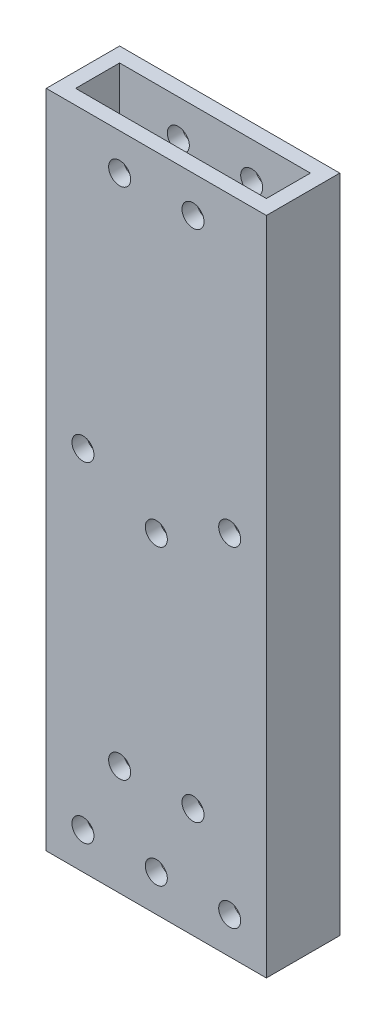
ISO-10303-21;
HEADER;
FILE_DESCRIPTION(('STEP AP214'),'2;1');
FILE_NAME('part.step','',(''),(''),'','','');
FILE_SCHEMA(('AUTOMOTIVE_DESIGN { 1 0 10303 214 1 1 1 1 }'));
ENDSEC;
DATA;
#1=APPLICATION_CONTEXT('core data for automotive mechanical design processes');
#2=APPLICATION_PROTOCOL_DEFINITION('international standard','automotive_design',2000,#1);
#3=PRODUCT_CONTEXT('',#1,'mechanical');
#4=PRODUCT('Part','Part','',(#3));
#5=PRODUCT_RELATED_PRODUCT_CATEGORY('part','',(#4));
#6=PRODUCT_DEFINITION_FORMATION('','',#4);
#7=PRODUCT_DEFINITION_CONTEXT('part definition',#1,'design');
#8=PRODUCT_DEFINITION('design','',#6,#7);
#9=PRODUCT_DEFINITION_SHAPE('','',#8);
#10=(LENGTH_UNIT() NAMED_UNIT(*) SI_UNIT(.MILLI.,.METRE.));
#11=(NAMED_UNIT(*) PLANE_ANGLE_UNIT() SI_UNIT($,.RADIAN.));
#12=(NAMED_UNIT(*) SI_UNIT($,.STERADIAN.) SOLID_ANGLE_UNIT());
#13=UNCERTAINTY_MEASURE_WITH_UNIT(LENGTH_MEASURE(1.E-05),#10,'distance_accuracy_value','');
#14=(GEOMETRIC_REPRESENTATION_CONTEXT(3) GLOBAL_UNCERTAINTY_ASSIGNED_CONTEXT((#13)) GLOBAL_UNIT_ASSIGNED_CONTEXT((#10,
#11,#12)) REPRESENTATION_CONTEXT('',''));
#15=CARTESIAN_POINT('',(0.,0.,0.));
#16=DIRECTION('',(0.,0.,1.));
#17=DIRECTION('',(1.,0.,0.));
#18=AXIS2_PLACEMENT_3D('',#15,#16,#17);
#19=CARTESIAN_POINT('',(0.,45.,0.));
#20=DIRECTION('',(0.,1.,0.));
#21=DIRECTION('',(0.,0.,1.));
#22=AXIS2_PLACEMENT_3D('',#19,#20,#21);
#23=PLANE('',#22);
#24=DIRECTION('',(0.,0.,-1.));
#25=VECTOR('',#24,1.);
#26=CARTESIAN_POINT('',(15.,45.,-5.));
#27=LINE('',#26,#25);
#28=CARTESIAN_POINT('',(15.,45.,5.));
#29=VERTEX_POINT('',#28);
#30=CARTESIAN_POINT('',(15.,45.,-5.));
#31=VERTEX_POINT('',#30);
#32=EDGE_CURVE('E140',#29,#31,#27,.T.);
#33=ORIENTED_EDGE('',*,*,#32,.T.);
#34=DIRECTION('',(-1.,0.,0.));
#35=VECTOR('',#34,1.);
#36=CARTESIAN_POINT('',(-15.,45.,-5.));
#37=LINE('',#36,#35);
#38=CARTESIAN_POINT('',(-15.,45.,-5.));
#39=VERTEX_POINT('',#38);
#40=EDGE_CURVE('E143',#31,#39,#37,.T.);
#41=ORIENTED_EDGE('',*,*,#40,.T.);
#42=DIRECTION('',(0.,0.,1.));
#43=VECTOR('',#42,1.);
#44=CARTESIAN_POINT('',(-15.,45.,-5.));
#45=LINE('',#44,#43);
#46=CARTESIAN_POINT('',(-15.,45.,5.));
#47=VERTEX_POINT('',#46);
#48=EDGE_CURVE('E146',#39,#47,#45,.T.);
#49=ORIENTED_EDGE('',*,*,#48,.T.);
#50=DIRECTION('',(1.,0.,0.));
#51=VECTOR('',#50,1.);
#52=CARTESIAN_POINT('',(-15.,45.,5.));
#53=LINE('',#52,#51);
#54=EDGE_CURVE('E148',#47,#29,#53,.T.);
#55=ORIENTED_EDGE('',*,*,#54,.T.);
#56=EDGE_LOOP('',(#33,#41,#49,#55));
#57=FACE_BOUND('',#56,.T.);
#58=DIRECTION('',(-1.,0.,0.));
#59=VECTOR('',#58,1.);
#60=CARTESIAN_POINT('',(-13.,45.,-3.));
#61=LINE('',#60,#59);
#62=CARTESIAN_POINT('',(13.,45.,-3.));
#63=VERTEX_POINT('',#62);
#64=CARTESIAN_POINT('',(-13.,45.,-3.));
#65=VERTEX_POINT('',#64);
#66=EDGE_CURVE('E110',#63,#65,#61,.T.);
#67=ORIENTED_EDGE('',*,*,#66,.F.);
#68=DIRECTION('',(0.,0.,-1.));
#69=VECTOR('',#68,1.);
#70=CARTESIAN_POINT('',(13.,45.,-3.));
#71=LINE('',#70,#69);
#72=CARTESIAN_POINT('',(13.,45.,3.));
#73=VERTEX_POINT('',#72);
#74=EDGE_CURVE('E102',#73,#63,#71,.T.);
#75=ORIENTED_EDGE('',*,*,#74,.F.);
#76=DIRECTION('',(1.,0.,0.));
#77=VECTOR('',#76,1.);
#78=CARTESIAN_POINT('',(-13.,45.,3.));
#79=LINE('',#78,#77);
#80=CARTESIAN_POINT('',(-13.,45.,3.));
#81=VERTEX_POINT('',#80);
#82=EDGE_CURVE('E124',#81,#73,#79,.T.);
#83=ORIENTED_EDGE('',*,*,#82,.F.);
#84=DIRECTION('',(0.,0.,1.));
#85=VECTOR('',#84,1.);
#86=CARTESIAN_POINT('',(-13.,45.,-3.));
#87=LINE('',#86,#85);
#88=EDGE_CURVE('E122',#65,#81,#87,.T.);
#89=ORIENTED_EDGE('',*,*,#88,.F.);
#90=EDGE_LOOP('',(#67,#75,#83,#89));
#91=FACE_BOUND('',#90,.T.);
#92=ADVANCED_FACE('F35',(#57,#91),#23,.T.);
#93=CARTESIAN_POINT('',(0.,-45.,0.));
#94=DIRECTION('',(0.,1.,0.));
#95=DIRECTION('',(0.,0.,1.));
#96=AXIS2_PLACEMENT_3D('',#93,#94,#95);
#97=PLANE('',#96);
#98=DIRECTION('',(0.,0.,-1.));
#99=VECTOR('',#98,1.);
#100=CARTESIAN_POINT('',(15.,-45.,-5.));
#101=LINE('',#100,#99);
#102=CARTESIAN_POINT('',(15.,-45.,5.));
#103=VERTEX_POINT('',#102);
#104=CARTESIAN_POINT('',(15.,-45.,-5.));
#105=VERTEX_POINT('',#104);
#106=EDGE_CURVE('E118',#103,#105,#101,.T.);
#107=ORIENTED_EDGE('',*,*,#106,.F.);
#108=DIRECTION('',(1.,0.,0.));
#109=VECTOR('',#108,1.);
#110=CARTESIAN_POINT('',(-15.,-45.,5.));
#111=LINE('',#110,#109);
#112=CARTESIAN_POINT('',(-15.,-45.,5.));
#113=VERTEX_POINT('',#112);
#114=EDGE_CURVE('E144',#113,#103,#111,.T.);
#115=ORIENTED_EDGE('',*,*,#114,.F.);
#116=DIRECTION('',(0.,0.,1.));
#117=VECTOR('',#116,1.);
#118=CARTESIAN_POINT('',(-15.,-45.,-5.));
#119=LINE('',#118,#117);
#120=CARTESIAN_POINT('',(-15.,-45.,-5.));
#121=VERTEX_POINT('',#120);
#122=EDGE_CURVE('E155',#121,#113,#119,.T.);
#123=ORIENTED_EDGE('',*,*,#122,.F.);
#124=DIRECTION('',(-1.,0.,0.));
#125=VECTOR('',#124,1.);
#126=CARTESIAN_POINT('',(-15.,-45.,-5.));
#127=LINE('',#126,#125);
#128=EDGE_CURVE('E153',#105,#121,#127,.T.);
#129=ORIENTED_EDGE('',*,*,#128,.F.);
#130=EDGE_LOOP('',(#107,#115,#123,#129));
#131=FACE_BOUND('',#130,.T.);
#132=DIRECTION('',(0.,0.,-1.));
#133=VECTOR('',#132,1.);
#134=CARTESIAN_POINT('',(13.,-45.,-3.));
#135=LINE('',#134,#133);
#136=CARTESIAN_POINT('',(13.,-45.,3.));
#137=VERTEX_POINT('',#136);
#138=CARTESIAN_POINT('',(13.,-45.,-3.));
#139=VERTEX_POINT('',#138);
#140=EDGE_CURVE('E60',#137,#139,#135,.T.);
#141=ORIENTED_EDGE('',*,*,#140,.T.);
#142=DIRECTION('',(-1.,0.,0.));
#143=VECTOR('',#142,1.);
#144=CARTESIAN_POINT('',(-13.,-45.,-3.));
#145=LINE('',#144,#143);
#146=CARTESIAN_POINT('',(-13.,-45.,-3.));
#147=VERTEX_POINT('',#146);
#148=EDGE_CURVE('E117',#139,#147,#145,.T.);
#149=ORIENTED_EDGE('',*,*,#148,.T.);
#150=DIRECTION('',(0.,0.,1.));
#151=VECTOR('',#150,1.);
#152=CARTESIAN_POINT('',(-13.,-45.,-3.));
#153=LINE('',#152,#151);
#154=CARTESIAN_POINT('',(-13.,-45.,3.));
#155=VERTEX_POINT('',#154);
#156=EDGE_CURVE('E132',#147,#155,#153,.T.);
#157=ORIENTED_EDGE('',*,*,#156,.T.);
#158=DIRECTION('',(1.,0.,0.));
#159=VECTOR('',#158,1.);
#160=CARTESIAN_POINT('',(-13.,-45.,3.));
#161=LINE('',#160,#159);
#162=EDGE_CURVE('E111',#155,#137,#161,.T.);
#163=ORIENTED_EDGE('',*,*,#162,.T.);
#164=EDGE_LOOP('',(#141,#149,#157,#163));
#165=FACE_BOUND('',#164,.T.);
#166=ADVANCED_FACE('F243',(#131,#165),#97,.F.);
#167=CARTESIAN_POINT('',(15.,45.,-5.));
#168=DIRECTION('',(-1.,0.,0.));
#169=DIRECTION('',(0.,0.,1.));
#170=AXIS2_PLACEMENT_3D('',#167,#168,#169);
#171=PLANE('',#170);
#172=ORIENTED_EDGE('',*,*,#106,.T.);
#173=DIRECTION('',(0.,-1.,0.));
#174=VECTOR('',#173,1.);
#175=CARTESIAN_POINT('',(15.,45.,-5.));
#176=LINE('',#175,#174);
#177=EDGE_CURVE('E11',#31,#105,#176,.T.);
#178=ORIENTED_EDGE('',*,*,#177,.F.);
#179=ORIENTED_EDGE('',*,*,#32,.F.);
#180=DIRECTION('',(0.,-1.,0.));
#181=VECTOR('',#180,1.);
#182=CARTESIAN_POINT('',(15.,45.,5.));
#183=LINE('',#182,#181);
#184=EDGE_CURVE('E150',#29,#103,#183,.T.);
#185=ORIENTED_EDGE('',*,*,#184,.T.);
#186=EDGE_LOOP('',(#172,#178,#179,#185));
#187=FACE_BOUND('',#186,.T.);
#188=ADVANCED_FACE('F37',(#187),#171,.F.);
#189=CARTESIAN_POINT('',(-15.,45.,-5.));
#190=DIRECTION('',(0.,0.,1.));
#191=DIRECTION('',(1.,0.,0.));
#192=AXIS2_PLACEMENT_3D('',#189,#190,#191);
#193=PLANE('',#192);
#194=CARTESIAN_POINT('',(10.0000000000001,5.00000000000476,-5.));
#195=DIRECTION('',(0.,0.,1.));
#196=DIRECTION('',(1.,0.,0.));
#197=AXIS2_PLACEMENT_3D('',#194,#195,#196);
#198=CIRCLE('',#197,1.5);
#199=CARTESIAN_POINT('',(11.5000000000001,5.00000000000476,-5.));
#200=VERTEX_POINT('',#199);
#201=EDGE_CURVE('E279',#200,#200,#198,.T.);
#202=ORIENTED_EDGE('',*,*,#201,.T.);
#203=EDGE_LOOP('',(#202));
#204=FACE_BOUND('',#203,.T.);
#205=CARTESIAN_POINT('',(0.,0.,-5.));
#206=DIRECTION('',(0.,0.,1.));
#207=DIRECTION('',(1.,0.,0.));
#208=AXIS2_PLACEMENT_3D('',#205,#206,#207);
#209=CIRCLE('',#208,1.49999999999998);
#210=CARTESIAN_POINT('',(1.49999999999998,0.,-5.));
#211=VERTEX_POINT('',#210);
#212=EDGE_CURVE('E283',#211,#211,#209,.T.);
#213=ORIENTED_EDGE('',*,*,#212,.T.);
#214=EDGE_LOOP('',(#213));
#215=FACE_BOUND('',#214,.T.);
#216=CARTESIAN_POINT('',(-9.9999999999999,5.00000000000476,-5.));
#217=DIRECTION('',(0.,0.,1.));
#218=DIRECTION('',(1.,0.,0.));
#219=AXIS2_PLACEMENT_3D('',#216,#217,#218);
#220=CIRCLE('',#219,1.5);
#221=CARTESIAN_POINT('',(-8.4999999999999,5.00000000000476,-5.));
#222=VERTEX_POINT('',#221);
#223=EDGE_CURVE('E287',#222,#222,#220,.T.);
#224=ORIENTED_EDGE('',*,*,#223,.T.);
#225=EDGE_LOOP('',(#224));
#226=FACE_BOUND('',#225,.T.);
#227=CARTESIAN_POINT('',(-4.9999999999999,40.0000000000048,-5.));
#228=DIRECTION('',(0.,0.,1.));
#229=DIRECTION('',(1.,0.,0.));
#230=AXIS2_PLACEMENT_3D('',#227,#228,#229);
#231=CIRCLE('',#230,1.5);
#232=CARTESIAN_POINT('',(-3.4999999999999,40.0000000000048,-5.));
#233=VERTEX_POINT('',#232);
#234=EDGE_CURVE('E291',#233,#233,#231,.T.);
#235=ORIENTED_EDGE('',*,*,#234,.T.);
#236=EDGE_LOOP('',(#235));
#237=FACE_BOUND('',#236,.T.);
#238=CARTESIAN_POINT('',(5.0000000000001,-29.9999999999953,-5.));
#239=DIRECTION('',(0.,0.,1.));
#240=DIRECTION('',(1.,0.,0.));
#241=AXIS2_PLACEMENT_3D('',#238,#239,#240);
#242=CIRCLE('',#241,1.5);
#243=CARTESIAN_POINT('',(6.5000000000001,-29.9999999999953,-5.));
#244=VERTEX_POINT('',#243);
#245=EDGE_CURVE('E295',#244,#244,#242,.T.);
#246=ORIENTED_EDGE('',*,*,#245,.T.);
#247=EDGE_LOOP('',(#246));
#248=FACE_BOUND('',#247,.T.);
#249=CARTESIAN_POINT('',(-4.9999999999999,-29.9999999999953,-5.));
#250=DIRECTION('',(0.,0.,1.));
#251=DIRECTION('',(1.,0.,0.));
#252=AXIS2_PLACEMENT_3D('',#249,#250,#251);
#253=CIRCLE('',#252,1.5);
#254=CARTESIAN_POINT('',(-3.4999999999999,-29.9999999999953,-5.));
#255=VERTEX_POINT('',#254);
#256=EDGE_CURVE('E299',#255,#255,#253,.T.);
#257=ORIENTED_EDGE('',*,*,#256,.T.);
#258=EDGE_LOOP('',(#257));
#259=FACE_BOUND('',#258,.T.);
#260=CARTESIAN_POINT('',(-9.99999999999988,-39.9999999999952,-5.));
#261=DIRECTION('',(0.,0.,1.));
#262=DIRECTION('',(1.,0.,0.));
#263=AXIS2_PLACEMENT_3D('',#260,#261,#262);
#264=CIRCLE('',#263,1.5);
#265=CARTESIAN_POINT('',(-8.49999999999988,-39.9999999999952,-5.));
#266=VERTEX_POINT('',#265);
#267=EDGE_CURVE('E303',#266,#266,#264,.T.);
#268=ORIENTED_EDGE('',*,*,#267,.T.);
#269=EDGE_LOOP('',(#268));
#270=FACE_BOUND('',#269,.T.);
#271=CARTESIAN_POINT('',(1.11022302462516E-13,-39.9999999999946,-5.));
#272=DIRECTION('',(0.,0.,1.));
#273=DIRECTION('',(1.,0.,0.));
#274=AXIS2_PLACEMENT_3D('',#271,#272,#273);
#275=CIRCLE('',#274,1.50000000000038);
#276=CARTESIAN_POINT('',(1.50000000000049,-39.9999999999946,-5.));
#277=VERTEX_POINT('',#276);
#278=EDGE_CURVE('E307',#277,#277,#275,.T.);
#279=ORIENTED_EDGE('',*,*,#278,.T.);
#280=EDGE_LOOP('',(#279));
#281=FACE_BOUND('',#280,.T.);
#282=CARTESIAN_POINT('',(10.0000000000001,-39.9999999999952,-5.));
#283=DIRECTION('',(0.,0.,1.));
#284=DIRECTION('',(1.,0.,0.));
#285=AXIS2_PLACEMENT_3D('',#282,#283,#284);
#286=CIRCLE('',#285,1.5);
#287=CARTESIAN_POINT('',(11.5000000000001,-39.9999999999952,-5.));
#288=VERTEX_POINT('',#287);
#289=EDGE_CURVE('E311',#288,#288,#286,.T.);
#290=ORIENTED_EDGE('',*,*,#289,.T.);
#291=EDGE_LOOP('',(#290));
#292=FACE_BOUND('',#291,.T.);
#293=CARTESIAN_POINT('',(5.0000000000001,40.0000000000048,-5.));
#294=DIRECTION('',(0.,0.,1.));
#295=DIRECTION('',(1.,0.,0.));
#296=AXIS2_PLACEMENT_3D('',#293,#294,#295);
#297=CIRCLE('',#296,1.5);
#298=CARTESIAN_POINT('',(6.5000000000001,40.0000000000048,-5.));
#299=VERTEX_POINT('',#298);
#300=EDGE_CURVE('E169',#299,#299,#297,.T.);
#301=ORIENTED_EDGE('',*,*,#300,.T.);
#302=EDGE_LOOP('',(#301));
#303=FACE_BOUND('',#302,.T.);
#304=ORIENTED_EDGE('',*,*,#128,.T.);
#305=DIRECTION('',(0.,-1.,0.));
#306=VECTOR('',#305,1.);
#307=CARTESIAN_POINT('',(-15.,45.,-5.));
#308=LINE('',#307,#306);
#309=EDGE_CURVE('E44',#39,#121,#308,.T.);
#310=ORIENTED_EDGE('',*,*,#309,.F.);
#311=ORIENTED_EDGE('',*,*,#40,.F.);
#312=ORIENTED_EDGE('',*,*,#177,.T.);
#313=EDGE_LOOP('',(#304,#310,#311,#312));
#314=FACE_BOUND('',#313,.T.);
#315=ADVANCED_FACE('F268',(#204,#215,#226,#237,#248,#259,#270,#281,#292,#303,#314),#193,.F.);
#316=CARTESIAN_POINT('',(-15.,45.,-5.));
#317=DIRECTION('',(1.,0.,0.));
#318=DIRECTION('',(0.,0.,-1.));
#319=AXIS2_PLACEMENT_3D('',#316,#317,#318);
#320=PLANE('',#319);
#321=ORIENTED_EDGE('',*,*,#122,.T.);
#322=DIRECTION('',(0.,-1.,0.));
#323=VECTOR('',#322,1.);
#324=CARTESIAN_POINT('',(-15.,45.,5.));
#325=LINE('',#324,#323);
#326=EDGE_CURVE('E160',#47,#113,#325,.T.);
#327=ORIENTED_EDGE('',*,*,#326,.F.);
#328=ORIENTED_EDGE('',*,*,#48,.F.);
#329=ORIENTED_EDGE('',*,*,#309,.T.);
#330=EDGE_LOOP('',(#321,#327,#328,#329));
#331=FACE_BOUND('',#330,.T.);
#332=ADVANCED_FACE('F265',(#331),#320,.F.);
#333=CARTESIAN_POINT('',(-15.,45.,5.));
#334=DIRECTION('',(0.,0.,-1.));
#335=DIRECTION('',(-1.,0.,0.));
#336=AXIS2_PLACEMENT_3D('',#333,#334,#335);
#337=PLANE('',#336);
#338=CARTESIAN_POINT('',(10.0000000000001,5.00000000000476,5.));
#339=DIRECTION('',(0.,0.,1.));
#340=DIRECTION('',(1.,0.,0.));
#341=AXIS2_PLACEMENT_3D('',#338,#339,#340);
#342=CIRCLE('',#341,1.5);
#343=CARTESIAN_POINT('',(11.5000000000001,5.00000000000476,5.));
#344=VERTEX_POINT('',#343);
#345=EDGE_CURVE('E448',#344,#344,#342,.T.);
#346=ORIENTED_EDGE('',*,*,#345,.F.);
#347=EDGE_LOOP('',(#346));
#348=FACE_BOUND('',#347,.T.);
#349=CARTESIAN_POINT('',(0.,0.,5.));
#350=DIRECTION('',(0.,0.,1.));
#351=DIRECTION('',(1.,0.,0.));
#352=AXIS2_PLACEMENT_3D('',#349,#350,#351);
#353=CIRCLE('',#352,1.49999999999998);
#354=CARTESIAN_POINT('',(1.49999999999998,0.,5.));
#355=VERTEX_POINT('',#354);
#356=EDGE_CURVE('E452',#355,#355,#353,.T.);
#357=ORIENTED_EDGE('',*,*,#356,.F.);
#358=EDGE_LOOP('',(#357));
#359=FACE_BOUND('',#358,.T.);
#360=CARTESIAN_POINT('',(-9.9999999999999,5.00000000000476,5.));
#361=DIRECTION('',(0.,0.,1.));
#362=DIRECTION('',(1.,0.,0.));
#363=AXIS2_PLACEMENT_3D('',#360,#361,#362);
#364=CIRCLE('',#363,1.5);
#365=CARTESIAN_POINT('',(-8.4999999999999,5.00000000000476,5.));
#366=VERTEX_POINT('',#365);
#367=EDGE_CURVE('E456',#366,#366,#364,.T.);
#368=ORIENTED_EDGE('',*,*,#367,.F.);
#369=EDGE_LOOP('',(#368));
#370=FACE_BOUND('',#369,.T.);
#371=CARTESIAN_POINT('',(-4.9999999999999,40.0000000000048,5.));
#372=DIRECTION('',(0.,0.,1.));
#373=DIRECTION('',(1.,0.,0.));
#374=AXIS2_PLACEMENT_3D('',#371,#372,#373);
#375=CIRCLE('',#374,1.5);
#376=CARTESIAN_POINT('',(-3.4999999999999,40.0000000000048,5.));
#377=VERTEX_POINT('',#376);
#378=EDGE_CURVE('E460',#377,#377,#375,.T.);
#379=ORIENTED_EDGE('',*,*,#378,.F.);
#380=EDGE_LOOP('',(#379));
#381=FACE_BOUND('',#380,.T.);
#382=CARTESIAN_POINT('',(5.0000000000001,-29.9999999999953,5.));
#383=DIRECTION('',(0.,0.,1.));
#384=DIRECTION('',(1.,0.,0.));
#385=AXIS2_PLACEMENT_3D('',#382,#383,#384);
#386=CIRCLE('',#385,1.5);
#387=CARTESIAN_POINT('',(6.5000000000001,-29.9999999999953,5.));
#388=VERTEX_POINT('',#387);
#389=EDGE_CURVE('E464',#388,#388,#386,.T.);
#390=ORIENTED_EDGE('',*,*,#389,.F.);
#391=EDGE_LOOP('',(#390));
#392=FACE_BOUND('',#391,.T.);
#393=CARTESIAN_POINT('',(-4.9999999999999,-29.9999999999953,5.));
#394=DIRECTION('',(0.,0.,1.));
#395=DIRECTION('',(1.,0.,0.));
#396=AXIS2_PLACEMENT_3D('',#393,#394,#395);
#397=CIRCLE('',#396,1.5);
#398=CARTESIAN_POINT('',(-3.4999999999999,-29.9999999999953,5.));
#399=VERTEX_POINT('',#398);
#400=EDGE_CURVE('E431',#399,#399,#397,.T.);
#401=ORIENTED_EDGE('',*,*,#400,.F.);
#402=EDGE_LOOP('',(#401));
#403=FACE_BOUND('',#402,.T.);
#404=CARTESIAN_POINT('',(-9.99999999999988,-39.9999999999952,5.));
#405=DIRECTION('',(0.,0.,1.));
#406=DIRECTION('',(1.,0.,0.));
#407=AXIS2_PLACEMENT_3D('',#404,#405,#406);
#408=CIRCLE('',#407,1.5);
#409=CARTESIAN_POINT('',(-8.49999999999988,-39.9999999999952,5.));
#410=VERTEX_POINT('',#409);
#411=EDGE_CURVE('E432',#410,#410,#408,.T.);
#412=ORIENTED_EDGE('',*,*,#411,.F.);
#413=EDGE_LOOP('',(#412));
#414=FACE_BOUND('',#413,.T.);
#415=CARTESIAN_POINT('',(1.11022302462516E-13,-39.9999999999946,5.));
#416=DIRECTION('',(0.,0.,1.));
#417=DIRECTION('',(1.,0.,0.));
#418=AXIS2_PLACEMENT_3D('',#415,#416,#417);
#419=CIRCLE('',#418,1.50000000000038);
#420=CARTESIAN_POINT('',(1.50000000000049,-39.9999999999946,5.));
#421=VERTEX_POINT('',#420);
#422=EDGE_CURVE('E332',#421,#421,#419,.T.);
#423=ORIENTED_EDGE('',*,*,#422,.F.);
#424=EDGE_LOOP('',(#423));
#425=FACE_BOUND('',#424,.T.);
#426=CARTESIAN_POINT('',(10.0000000000001,-39.9999999999952,5.));
#427=DIRECTION('',(0.,0.,1.));
#428=DIRECTION('',(1.,0.,0.));
#429=AXIS2_PLACEMENT_3D('',#426,#427,#428);
#430=CIRCLE('',#429,1.5);
#431=CARTESIAN_POINT('',(11.5000000000001,-39.9999999999952,5.));
#432=VERTEX_POINT('',#431);
#433=EDGE_CURVE('E442',#432,#432,#430,.T.);
#434=ORIENTED_EDGE('',*,*,#433,.F.);
#435=EDGE_LOOP('',(#434));
#436=FACE_BOUND('',#435,.T.);
#437=CARTESIAN_POINT('',(5.0000000000001,40.0000000000048,5.));
#438=DIRECTION('',(0.,0.,1.));
#439=DIRECTION('',(1.,0.,0.));
#440=AXIS2_PLACEMENT_3D('',#437,#438,#439);
#441=CIRCLE('',#440,1.5);
#442=CARTESIAN_POINT('',(6.5000000000001,40.0000000000048,5.));
#443=VERTEX_POINT('',#442);
#444=EDGE_CURVE('E327',#443,#443,#441,.T.);
#445=ORIENTED_EDGE('',*,*,#444,.F.);
#446=EDGE_LOOP('',(#445));
#447=FACE_BOUND('',#446,.T.);
#448=ORIENTED_EDGE('',*,*,#114,.T.);
#449=ORIENTED_EDGE('',*,*,#184,.F.);
#450=ORIENTED_EDGE('',*,*,#54,.F.);
#451=ORIENTED_EDGE('',*,*,#326,.T.);
#452=EDGE_LOOP('',(#448,#449,#450,#451));
#453=FACE_BOUND('',#452,.T.);
#454=ADVANCED_FACE('F262',(#348,#359,#370,#381,#392,#403,#414,#425,#436,#447,#453),#337,.F.);
#455=CARTESIAN_POINT('',(13.,45.,-3.));
#456=DIRECTION('',(-1.,0.,0.));
#457=DIRECTION('',(0.,0.,1.));
#458=AXIS2_PLACEMENT_3D('',#455,#456,#457);
#459=PLANE('',#458);
#460=ORIENTED_EDGE('',*,*,#140,.F.);
#461=DIRECTION('',(0.,-1.,0.));
#462=VECTOR('',#461,1.);
#463=CARTESIAN_POINT('',(13.,45.,3.));
#464=LINE('',#463,#462);
#465=EDGE_CURVE('E106',#73,#137,#464,.T.);
#466=ORIENTED_EDGE('',*,*,#465,.F.);
#467=ORIENTED_EDGE('',*,*,#74,.T.);
#468=DIRECTION('',(0.,-1.,0.));
#469=VECTOR('',#468,1.);
#470=CARTESIAN_POINT('',(13.,45.,-3.));
#471=LINE('',#470,#469);
#472=EDGE_CURVE('E105',#63,#139,#471,.T.);
#473=ORIENTED_EDGE('',*,*,#472,.T.);
#474=EDGE_LOOP('',(#460,#466,#467,#473));
#475=FACE_BOUND('',#474,.T.);
#476=ADVANCED_FACE('F104',(#475),#459,.T.);
#477=CARTESIAN_POINT('',(-13.,45.,-3.));
#478=DIRECTION('',(0.,0.,1.));
#479=DIRECTION('',(1.,0.,0.));
#480=AXIS2_PLACEMENT_3D('',#477,#478,#479);
#481=PLANE('',#480);
#482=CARTESIAN_POINT('',(10.0000000000001,5.00000000000476,-3.));
#483=DIRECTION('',(0.,0.,1.));
#484=DIRECTION('',(1.,0.,0.));
#485=AXIS2_PLACEMENT_3D('',#482,#483,#484);
#486=CIRCLE('',#485,1.5);
#487=CARTESIAN_POINT('',(11.5000000000001,5.00000000000476,-3.));
#488=VERTEX_POINT('',#487);
#489=EDGE_CURVE('E130',#488,#488,#486,.T.);
#490=ORIENTED_EDGE('',*,*,#489,.F.);
#491=EDGE_LOOP('',(#490));
#492=FACE_BOUND('',#491,.T.);
#493=CARTESIAN_POINT('',(0.,0.,-3.));
#494=DIRECTION('',(0.,0.,1.));
#495=DIRECTION('',(1.,0.,0.));
#496=AXIS2_PLACEMENT_3D('',#493,#494,#495);
#497=CIRCLE('',#496,1.49999999999998);
#498=CARTESIAN_POINT('',(1.49999999999998,0.,-3.));
#499=VERTEX_POINT('',#498);
#500=EDGE_CURVE('E199',#499,#499,#497,.T.);
#501=ORIENTED_EDGE('',*,*,#500,.F.);
#502=EDGE_LOOP('',(#501));
#503=FACE_BOUND('',#502,.T.);
#504=CARTESIAN_POINT('',(-9.9999999999999,5.00000000000476,-3.));
#505=DIRECTION('',(0.,0.,1.));
#506=DIRECTION('',(1.,0.,0.));
#507=AXIS2_PLACEMENT_3D('',#504,#505,#506);
#508=CIRCLE('',#507,1.5);
#509=CARTESIAN_POINT('',(-8.4999999999999,5.00000000000476,-3.));
#510=VERTEX_POINT('',#509);
#511=EDGE_CURVE('E196',#510,#510,#508,.T.);
#512=ORIENTED_EDGE('',*,*,#511,.F.);
#513=EDGE_LOOP('',(#512));
#514=FACE_BOUND('',#513,.T.);
#515=CARTESIAN_POINT('',(-4.9999999999999,40.0000000000048,-3.));
#516=DIRECTION('',(0.,0.,1.));
#517=DIRECTION('',(1.,0.,0.));
#518=AXIS2_PLACEMENT_3D('',#515,#516,#517);
#519=CIRCLE('',#518,1.5);
#520=CARTESIAN_POINT('',(-3.4999999999999,40.0000000000048,-3.));
#521=VERTEX_POINT('',#520);
#522=EDGE_CURVE('E193',#521,#521,#519,.T.);
#523=ORIENTED_EDGE('',*,*,#522,.F.);
#524=EDGE_LOOP('',(#523));
#525=FACE_BOUND('',#524,.T.);
#526=CARTESIAN_POINT('',(5.0000000000001,-29.9999999999953,-3.));
#527=DIRECTION('',(0.,0.,1.));
#528=DIRECTION('',(1.,0.,0.));
#529=AXIS2_PLACEMENT_3D('',#526,#527,#528);
#530=CIRCLE('',#529,1.5);
#531=CARTESIAN_POINT('',(6.5000000000001,-29.9999999999953,-3.));
#532=VERTEX_POINT('',#531);
#533=EDGE_CURVE('E189',#532,#532,#530,.T.);
#534=ORIENTED_EDGE('',*,*,#533,.F.);
#535=EDGE_LOOP('',(#534));
#536=FACE_BOUND('',#535,.T.);
#537=CARTESIAN_POINT('',(-4.9999999999999,-29.9999999999953,-3.));
#538=DIRECTION('',(0.,0.,1.));
#539=DIRECTION('',(1.,0.,0.));
#540=AXIS2_PLACEMENT_3D('',#537,#538,#539);
#541=CIRCLE('',#540,1.5);
#542=CARTESIAN_POINT('',(-3.4999999999999,-29.9999999999953,-3.));
#543=VERTEX_POINT('',#542);
#544=EDGE_CURVE('E185',#543,#543,#541,.T.);
#545=ORIENTED_EDGE('',*,*,#544,.F.);
#546=EDGE_LOOP('',(#545));
#547=FACE_BOUND('',#546,.T.);
#548=CARTESIAN_POINT('',(-9.99999999999988,-39.9999999999952,-3.));
#549=DIRECTION('',(0.,0.,1.));
#550=DIRECTION('',(1.,0.,0.));
#551=AXIS2_PLACEMENT_3D('',#548,#549,#550);
#552=CIRCLE('',#551,1.5);
#553=CARTESIAN_POINT('',(-8.49999999999988,-39.9999999999952,-3.));
#554=VERTEX_POINT('',#553);
#555=EDGE_CURVE('E181',#554,#554,#552,.T.);
#556=ORIENTED_EDGE('',*,*,#555,.F.);
#557=EDGE_LOOP('',(#556));
#558=FACE_BOUND('',#557,.T.);
#559=CARTESIAN_POINT('',(1.11022302462516E-13,-39.9999999999946,-3.));
#560=DIRECTION('',(0.,0.,1.));
#561=DIRECTION('',(1.,0.,0.));
#562=AXIS2_PLACEMENT_3D('',#559,#560,#561);
#563=CIRCLE('',#562,1.50000000000038);
#564=CARTESIAN_POINT('',(1.50000000000049,-39.9999999999946,-3.));
#565=VERTEX_POINT('',#564);
#566=EDGE_CURVE('E177',#565,#565,#563,.T.);
#567=ORIENTED_EDGE('',*,*,#566,.F.);
#568=EDGE_LOOP('',(#567));
#569=FACE_BOUND('',#568,.T.);
#570=CARTESIAN_POINT('',(10.0000000000001,-39.9999999999952,-3.));
#571=DIRECTION('',(0.,0.,1.));
#572=DIRECTION('',(1.,0.,0.));
#573=AXIS2_PLACEMENT_3D('',#570,#571,#572);
#574=CIRCLE('',#573,1.5);
#575=CARTESIAN_POINT('',(11.5000000000001,-39.9999999999952,-3.));
#576=VERTEX_POINT('',#575);
#577=EDGE_CURVE('E173',#576,#576,#574,.T.);
#578=ORIENTED_EDGE('',*,*,#577,.F.);
#579=EDGE_LOOP('',(#578));
#580=FACE_BOUND('',#579,.T.);
#581=CARTESIAN_POINT('',(5.0000000000001,40.0000000000048,-3.));
#582=DIRECTION('',(0.,0.,1.));
#583=DIRECTION('',(1.,0.,0.));
#584=AXIS2_PLACEMENT_3D('',#581,#582,#583);
#585=CIRCLE('',#584,1.5);
#586=CARTESIAN_POINT('',(6.5000000000001,40.0000000000048,-3.));
#587=VERTEX_POINT('',#586);
#588=EDGE_CURVE('E168',#587,#587,#585,.T.);
#589=ORIENTED_EDGE('',*,*,#588,.F.);
#590=EDGE_LOOP('',(#589));
#591=FACE_BOUND('',#590,.T.);
#592=ORIENTED_EDGE('',*,*,#148,.F.);
#593=ORIENTED_EDGE('',*,*,#472,.F.);
#594=ORIENTED_EDGE('',*,*,#66,.T.);
#595=DIRECTION('',(0.,-1.,0.));
#596=VECTOR('',#595,1.);
#597=CARTESIAN_POINT('',(-13.,45.,-3.));
#598=LINE('',#597,#596);
#599=EDGE_CURVE('E119',#65,#147,#598,.T.);
#600=ORIENTED_EDGE('',*,*,#599,.T.);
#601=EDGE_LOOP('',(#592,#593,#594,#600));
#602=FACE_BOUND('',#601,.T.);
#603=ADVANCED_FACE('F114',(#492,#503,#514,#525,#536,#547,#558,#569,#580,#591,#602),#481,.T.);
#604=CARTESIAN_POINT('',(-13.,45.,-3.));
#605=DIRECTION('',(1.,0.,0.));
#606=DIRECTION('',(0.,0.,-1.));
#607=AXIS2_PLACEMENT_3D('',#604,#605,#606);
#608=PLANE('',#607);
#609=ORIENTED_EDGE('',*,*,#156,.F.);
#610=ORIENTED_EDGE('',*,*,#599,.F.);
#611=ORIENTED_EDGE('',*,*,#88,.T.);
#612=DIRECTION('',(0.,-1.,0.));
#613=VECTOR('',#612,1.);
#614=CARTESIAN_POINT('',(-13.,45.,3.));
#615=LINE('',#614,#613);
#616=EDGE_CURVE('E52',#81,#155,#615,.T.);
#617=ORIENTED_EDGE('',*,*,#616,.T.);
#618=EDGE_LOOP('',(#609,#610,#611,#617));
#619=FACE_BOUND('',#618,.T.);
#620=ADVANCED_FACE('F223',(#619),#608,.T.);
#621=CARTESIAN_POINT('',(-13.,45.,3.));
#622=DIRECTION('',(0.,0.,-1.));
#623=DIRECTION('',(-1.,0.,0.));
#624=AXIS2_PLACEMENT_3D('',#621,#622,#623);
#625=PLANE('',#624);
#626=CARTESIAN_POINT('',(10.0000000000001,5.00000000000476,3.));
#627=DIRECTION('',(0.,0.,-1.));
#628=DIRECTION('',(-1.,0.,0.));
#629=AXIS2_PLACEMENT_3D('',#626,#627,#628);
#630=CIRCLE('',#629,1.5);
#631=CARTESIAN_POINT('',(8.5000000000001,5.00000000000476,3.));
#632=VERTEX_POINT('',#631);
#633=EDGE_CURVE('E39',#632,#632,#630,.T.);
#634=ORIENTED_EDGE('',*,*,#633,.F.);
#635=EDGE_LOOP('',(#634));
#636=FACE_BOUND('',#635,.T.);
#637=CARTESIAN_POINT('',(0.,0.,3.));
#638=DIRECTION('',(0.,0.,-1.));
#639=DIRECTION('',(-1.,0.,0.));
#640=AXIS2_PLACEMENT_3D('',#637,#638,#639);
#641=CIRCLE('',#640,1.49999999999998);
#642=CARTESIAN_POINT('',(-1.49999999999998,0.,3.));
#643=VERTEX_POINT('',#642);
#644=EDGE_CURVE('E197',#643,#643,#641,.T.);
#645=ORIENTED_EDGE('',*,*,#644,.F.);
#646=EDGE_LOOP('',(#645));
#647=FACE_BOUND('',#646,.T.);
#648=CARTESIAN_POINT('',(-9.9999999999999,5.00000000000476,3.));
#649=DIRECTION('',(0.,0.,-1.));
#650=DIRECTION('',(-1.,0.,0.));
#651=AXIS2_PLACEMENT_3D('',#648,#649,#650);
#652=CIRCLE('',#651,1.5);
#653=CARTESIAN_POINT('',(-11.4999999999999,5.00000000000476,3.));
#654=VERTEX_POINT('',#653);
#655=EDGE_CURVE('E194',#654,#654,#652,.T.);
#656=ORIENTED_EDGE('',*,*,#655,.F.);
#657=EDGE_LOOP('',(#656));
#658=FACE_BOUND('',#657,.T.);
#659=CARTESIAN_POINT('',(-4.9999999999999,40.0000000000048,3.));
#660=DIRECTION('',(0.,0.,-1.));
#661=DIRECTION('',(-1.,0.,0.));
#662=AXIS2_PLACEMENT_3D('',#659,#660,#661);
#663=CIRCLE('',#662,1.5);
#664=CARTESIAN_POINT('',(-6.4999999999999,40.0000000000048,3.));
#665=VERTEX_POINT('',#664);
#666=EDGE_CURVE('E190',#665,#665,#663,.T.);
#667=ORIENTED_EDGE('',*,*,#666,.F.);
#668=EDGE_LOOP('',(#667));
#669=FACE_BOUND('',#668,.T.);
#670=CARTESIAN_POINT('',(5.0000000000001,-29.9999999999953,3.));
#671=DIRECTION('',(0.,0.,-1.));
#672=DIRECTION('',(-1.,0.,0.));
#673=AXIS2_PLACEMENT_3D('',#670,#671,#672);
#674=CIRCLE('',#673,1.5);
#675=CARTESIAN_POINT('',(3.5000000000001,-29.9999999999953,3.));
#676=VERTEX_POINT('',#675);
#677=EDGE_CURVE('E186',#676,#676,#674,.T.);
#678=ORIENTED_EDGE('',*,*,#677,.F.);
#679=EDGE_LOOP('',(#678));
#680=FACE_BOUND('',#679,.T.);
#681=CARTESIAN_POINT('',(-4.9999999999999,-29.9999999999953,3.));
#682=DIRECTION('',(0.,0.,-1.));
#683=DIRECTION('',(-1.,0.,0.));
#684=AXIS2_PLACEMENT_3D('',#681,#682,#683);
#685=CIRCLE('',#684,1.5);
#686=CARTESIAN_POINT('',(-6.49999999999991,-29.9999999999953,3.));
#687=VERTEX_POINT('',#686);
#688=EDGE_CURVE('E182',#687,#687,#685,.T.);
#689=ORIENTED_EDGE('',*,*,#688,.F.);
#690=EDGE_LOOP('',(#689));
#691=FACE_BOUND('',#690,.T.);
#692=CARTESIAN_POINT('',(-9.99999999999988,-39.9999999999952,3.));
#693=DIRECTION('',(0.,0.,-1.));
#694=DIRECTION('',(-1.,0.,0.));
#695=AXIS2_PLACEMENT_3D('',#692,#693,#694);
#696=CIRCLE('',#695,1.5);
#697=CARTESIAN_POINT('',(-11.4999999999999,-39.9999999999952,3.));
#698=VERTEX_POINT('',#697);
#699=EDGE_CURVE('E178',#698,#698,#696,.T.);
#700=ORIENTED_EDGE('',*,*,#699,.F.);
#701=EDGE_LOOP('',(#700));
#702=FACE_BOUND('',#701,.T.);
#703=CARTESIAN_POINT('',(1.11022302462516E-13,-39.9999999999946,3.));
#704=DIRECTION('',(0.,0.,-1.));
#705=DIRECTION('',(-1.,0.,0.));
#706=AXIS2_PLACEMENT_3D('',#703,#704,#705);
#707=CIRCLE('',#706,1.50000000000038);
#708=CARTESIAN_POINT('',(-1.50000000000027,-39.9999999999946,3.));
#709=VERTEX_POINT('',#708);
#710=EDGE_CURVE('E174',#709,#709,#707,.T.);
#711=ORIENTED_EDGE('',*,*,#710,.F.);
#712=EDGE_LOOP('',(#711));
#713=FACE_BOUND('',#712,.T.);
#714=CARTESIAN_POINT('',(10.0000000000001,-39.9999999999952,3.));
#715=DIRECTION('',(0.,0.,-1.));
#716=DIRECTION('',(-1.,0.,0.));
#717=AXIS2_PLACEMENT_3D('',#714,#715,#716);
#718=CIRCLE('',#717,1.5);
#719=CARTESIAN_POINT('',(8.50000000000012,-39.9999999999952,3.));
#720=VERTEX_POINT('',#719);
#721=EDGE_CURVE('E170',#720,#720,#718,.T.);
#722=ORIENTED_EDGE('',*,*,#721,.F.);
#723=EDGE_LOOP('',(#722));
#724=FACE_BOUND('',#723,.T.);
#725=CARTESIAN_POINT('',(5.0000000000001,40.0000000000048,3.));
#726=DIRECTION('',(0.,0.,-1.));
#727=DIRECTION('',(-1.,0.,0.));
#728=AXIS2_PLACEMENT_3D('',#725,#726,#727);
#729=CIRCLE('',#728,1.5);
#730=CARTESIAN_POINT('',(3.5000000000001,40.0000000000048,3.));
#731=VERTEX_POINT('',#730);
#732=EDGE_CURVE('E165',#731,#731,#729,.T.);
#733=ORIENTED_EDGE('',*,*,#732,.F.);
#734=EDGE_LOOP('',(#733));
#735=FACE_BOUND('',#734,.T.);
#736=ORIENTED_EDGE('',*,*,#162,.F.);
#737=ORIENTED_EDGE('',*,*,#616,.F.);
#738=ORIENTED_EDGE('',*,*,#82,.T.);
#739=ORIENTED_EDGE('',*,*,#465,.T.);
#740=EDGE_LOOP('',(#736,#737,#738,#739));
#741=FACE_BOUND('',#740,.T.);
#742=ADVANCED_FACE('F219',(#636,#647,#658,#669,#680,#691,#702,#713,#724,#735,#741),#625,.T.);
#743=CARTESIAN_POINT('',(5.0000000000001,40.0000000000048,-5.));
#744=DIRECTION('',(0.,0.,1.));
#745=DIRECTION('',(1.,0.,0.));
#746=AXIS2_PLACEMENT_3D('',#743,#744,#745);
#747=CYLINDRICAL_SURFACE('',#746,1.5);
#748=ORIENTED_EDGE('',*,*,#732,.T.);
#749=EDGE_LOOP('',(#748));
#750=FACE_BOUND('',#749,.T.);
#751=ORIENTED_EDGE('',*,*,#444,.T.);
#752=EDGE_LOOP('',(#751));
#753=FACE_BOUND('',#752,.T.);
#754=ADVANCED_FACE('F222',(#750,#753),#747,.F.);
#755=CARTESIAN_POINT('',(10.0000000000001,-39.9999999999952,-5.));
#756=DIRECTION('',(0.,0.,1.));
#757=DIRECTION('',(1.,0.,0.));
#758=AXIS2_PLACEMENT_3D('',#755,#756,#757);
#759=CYLINDRICAL_SURFACE('',#758,1.5);
#760=ORIENTED_EDGE('',*,*,#721,.T.);
#761=EDGE_LOOP('',(#760));
#762=FACE_BOUND('',#761,.T.);
#763=ORIENTED_EDGE('',*,*,#433,.T.);
#764=EDGE_LOOP('',(#763));
#765=FACE_BOUND('',#764,.T.);
#766=ADVANCED_FACE('F372',(#762,#765),#759,.F.);
#767=CARTESIAN_POINT('',(1.11022302462516E-13,-39.9999999999946,-5.));
#768=DIRECTION('',(0.,0.,1.));
#769=DIRECTION('',(1.,0.,0.));
#770=AXIS2_PLACEMENT_3D('',#767,#768,#769);
#771=CYLINDRICAL_SURFACE('',#770,1.50000000000038);
#772=ORIENTED_EDGE('',*,*,#710,.T.);
#773=EDGE_LOOP('',(#772));
#774=FACE_BOUND('',#773,.T.);
#775=ORIENTED_EDGE('',*,*,#422,.T.);
#776=EDGE_LOOP('',(#775));
#777=FACE_BOUND('',#776,.T.);
#778=ADVANCED_FACE('F382',(#774,#777),#771,.F.);
#779=CARTESIAN_POINT('',(-9.99999999999988,-39.9999999999952,-5.));
#780=DIRECTION('',(0.,0.,1.));
#781=DIRECTION('',(1.,0.,0.));
#782=AXIS2_PLACEMENT_3D('',#779,#780,#781);
#783=CYLINDRICAL_SURFACE('',#782,1.5);
#784=ORIENTED_EDGE('',*,*,#699,.T.);
#785=EDGE_LOOP('',(#784));
#786=FACE_BOUND('',#785,.T.);
#787=ORIENTED_EDGE('',*,*,#411,.T.);
#788=EDGE_LOOP('',(#787));
#789=FACE_BOUND('',#788,.T.);
#790=ADVANCED_FACE('F390',(#786,#789),#783,.F.);
#791=CARTESIAN_POINT('',(-4.9999999999999,-29.9999999999953,-5.));
#792=DIRECTION('',(0.,0.,1.));
#793=DIRECTION('',(1.,0.,0.));
#794=AXIS2_PLACEMENT_3D('',#791,#792,#793);
#795=CYLINDRICAL_SURFACE('',#794,1.5);
#796=ORIENTED_EDGE('',*,*,#688,.T.);
#797=EDGE_LOOP('',(#796));
#798=FACE_BOUND('',#797,.T.);
#799=ORIENTED_EDGE('',*,*,#400,.T.);
#800=EDGE_LOOP('',(#799));
#801=FACE_BOUND('',#800,.T.);
#802=ADVANCED_FACE('F410',(#798,#801),#795,.F.);
#803=CARTESIAN_POINT('',(5.0000000000001,-29.9999999999953,-5.));
#804=DIRECTION('',(0.,0.,1.));
#805=DIRECTION('',(1.,0.,0.));
#806=AXIS2_PLACEMENT_3D('',#803,#804,#805);
#807=CYLINDRICAL_SURFACE('',#806,1.5);
#808=ORIENTED_EDGE('',*,*,#677,.T.);
#809=EDGE_LOOP('',(#808));
#810=FACE_BOUND('',#809,.T.);
#811=ORIENTED_EDGE('',*,*,#389,.T.);
#812=EDGE_LOOP('',(#811));
#813=FACE_BOUND('',#812,.T.);
#814=ADVANCED_FACE('F405',(#810,#813),#807,.F.);
#815=CARTESIAN_POINT('',(-4.9999999999999,40.0000000000048,-5.));
#816=DIRECTION('',(0.,0.,1.));
#817=DIRECTION('',(1.,0.,0.));
#818=AXIS2_PLACEMENT_3D('',#815,#816,#817);
#819=CYLINDRICAL_SURFACE('',#818,1.5);
#820=ORIENTED_EDGE('',*,*,#666,.T.);
#821=EDGE_LOOP('',(#820));
#822=FACE_BOUND('',#821,.T.);
#823=ORIENTED_EDGE('',*,*,#378,.T.);
#824=EDGE_LOOP('',(#823));
#825=FACE_BOUND('',#824,.T.);
#826=ADVANCED_FACE('F400',(#822,#825),#819,.F.);
#827=CARTESIAN_POINT('',(-9.9999999999999,5.00000000000476,-5.));
#828=DIRECTION('',(0.,0.,1.));
#829=DIRECTION('',(1.,0.,0.));
#830=AXIS2_PLACEMENT_3D('',#827,#828,#829);
#831=CYLINDRICAL_SURFACE('',#830,1.5);
#832=ORIENTED_EDGE('',*,*,#655,.T.);
#833=EDGE_LOOP('',(#832));
#834=FACE_BOUND('',#833,.T.);
#835=ORIENTED_EDGE('',*,*,#367,.T.);
#836=EDGE_LOOP('',(#835));
#837=FACE_BOUND('',#836,.T.);
#838=ADVANCED_FACE('F396',(#834,#837),#831,.F.);
#839=CARTESIAN_POINT('',(0.,0.,-5.));
#840=DIRECTION('',(0.,0.,1.));
#841=DIRECTION('',(1.,0.,0.));
#842=AXIS2_PLACEMENT_3D('',#839,#840,#841);
#843=CYLINDRICAL_SURFACE('',#842,1.49999999999998);
#844=ORIENTED_EDGE('',*,*,#644,.T.);
#845=EDGE_LOOP('',(#844));
#846=FACE_BOUND('',#845,.T.);
#847=ORIENTED_EDGE('',*,*,#356,.T.);
#848=EDGE_LOOP('',(#847));
#849=FACE_BOUND('',#848,.T.);
#850=ADVANCED_FACE('F373',(#846,#849),#843,.F.);
#851=CARTESIAN_POINT('',(10.0000000000001,5.00000000000476,-5.));
#852=DIRECTION('',(0.,0.,1.));
#853=DIRECTION('',(1.,0.,0.));
#854=AXIS2_PLACEMENT_3D('',#851,#852,#853);
#855=CYLINDRICAL_SURFACE('',#854,1.5);
#856=ORIENTED_EDGE('',*,*,#633,.T.);
#857=EDGE_LOOP('',(#856));
#858=FACE_BOUND('',#857,.T.);
#859=ORIENTED_EDGE('',*,*,#345,.T.);
#860=EDGE_LOOP('',(#859));
#861=FACE_BOUND('',#860,.T.);
#862=ADVANCED_FACE('F216',(#858,#861),#855,.F.);
#863=ORIENTED_EDGE('',*,*,#588,.T.);
#864=EDGE_LOOP('',(#863));
#865=FACE_BOUND('',#864,.T.);
#866=ORIENTED_EDGE('',*,*,#300,.F.);
#867=EDGE_LOOP('',(#866));
#868=FACE_BOUND('',#867,.T.);
#869=ADVANCED_FACE('F361',(#865,#868),#747,.F.);
#870=ORIENTED_EDGE('',*,*,#577,.T.);
#871=EDGE_LOOP('',(#870));
#872=FACE_BOUND('',#871,.T.);
#873=ORIENTED_EDGE('',*,*,#289,.F.);
#874=EDGE_LOOP('',(#873));
#875=FACE_BOUND('',#874,.T.);
#876=ADVANCED_FACE('F363',(#872,#875),#759,.F.);
#877=ORIENTED_EDGE('',*,*,#566,.T.);
#878=EDGE_LOOP('',(#877));
#879=FACE_BOUND('',#878,.T.);
#880=ORIENTED_EDGE('',*,*,#278,.F.);
#881=EDGE_LOOP('',(#880));
#882=FACE_BOUND('',#881,.T.);
#883=ADVANCED_FACE('F369',(#879,#882),#771,.F.);
#884=ORIENTED_EDGE('',*,*,#555,.T.);
#885=EDGE_LOOP('',(#884));
#886=FACE_BOUND('',#885,.T.);
#887=ORIENTED_EDGE('',*,*,#267,.F.);
#888=EDGE_LOOP('',(#887));
#889=FACE_BOUND('',#888,.T.);
#890=ADVANCED_FACE('F418',(#886,#889),#783,.F.);
#891=ORIENTED_EDGE('',*,*,#544,.T.);
#892=EDGE_LOOP('',(#891));
#893=FACE_BOUND('',#892,.T.);
#894=ORIENTED_EDGE('',*,*,#256,.F.);
#895=EDGE_LOOP('',(#894));
#896=FACE_BOUND('',#895,.T.);
#897=ADVANCED_FACE('F415',(#893,#896),#795,.F.);
#898=ORIENTED_EDGE('',*,*,#533,.T.);
#899=EDGE_LOOP('',(#898));
#900=FACE_BOUND('',#899,.T.);
#901=ORIENTED_EDGE('',*,*,#245,.F.);
#902=EDGE_LOOP('',(#901));
#903=FACE_BOUND('',#902,.T.);
#904=ADVANCED_FACE('F347',(#900,#903),#807,.F.);
#905=ORIENTED_EDGE('',*,*,#522,.T.);
#906=EDGE_LOOP('',(#905));
#907=FACE_BOUND('',#906,.T.);
#908=ORIENTED_EDGE('',*,*,#234,.F.);
#909=EDGE_LOOP('',(#908));
#910=FACE_BOUND('',#909,.T.);
#911=ADVANCED_FACE('F407',(#907,#910),#819,.F.);
#912=ORIENTED_EDGE('',*,*,#511,.T.);
#913=EDGE_LOOP('',(#912));
#914=FACE_BOUND('',#913,.T.);
#915=ORIENTED_EDGE('',*,*,#223,.F.);
#916=EDGE_LOOP('',(#915));
#917=FACE_BOUND('',#916,.T.);
#918=ADVANCED_FACE('F402',(#914,#917),#831,.F.);
#919=ORIENTED_EDGE('',*,*,#500,.T.);
#920=EDGE_LOOP('',(#919));
#921=FACE_BOUND('',#920,.T.);
#922=ORIENTED_EDGE('',*,*,#212,.F.);
#923=EDGE_LOOP('',(#922));
#924=FACE_BOUND('',#923,.T.);
#925=ADVANCED_FACE('F397',(#921,#924),#843,.F.);
#926=ORIENTED_EDGE('',*,*,#489,.T.);
#927=EDGE_LOOP('',(#926));
#928=FACE_BOUND('',#927,.T.);
#929=ORIENTED_EDGE('',*,*,#201,.F.);
#930=EDGE_LOOP('',(#929));
#931=FACE_BOUND('',#930,.T.);
#932=ADVANCED_FACE('F375',(#928,#931),#855,.F.);
#933=CLOSED_SHELL('',(#92,#166,#188,#315,#332,#454,#476,#603,#620,#742,#754,#766,#778,#790,#802,
#814,#826,#838,#850,#862,#869,#876,#883,#890,#897,#904,#911,#918,#925,#932));
#934=MANIFOLD_SOLID_BREP('B2',#933);
#935=ADVANCED_BREP_SHAPE_REPRESENTATION('',(#18,#934),#14);
#936=SHAPE_DEFINITION_REPRESENTATION(#9,#935);
ENDSEC;
END-ISO-10303-21;
